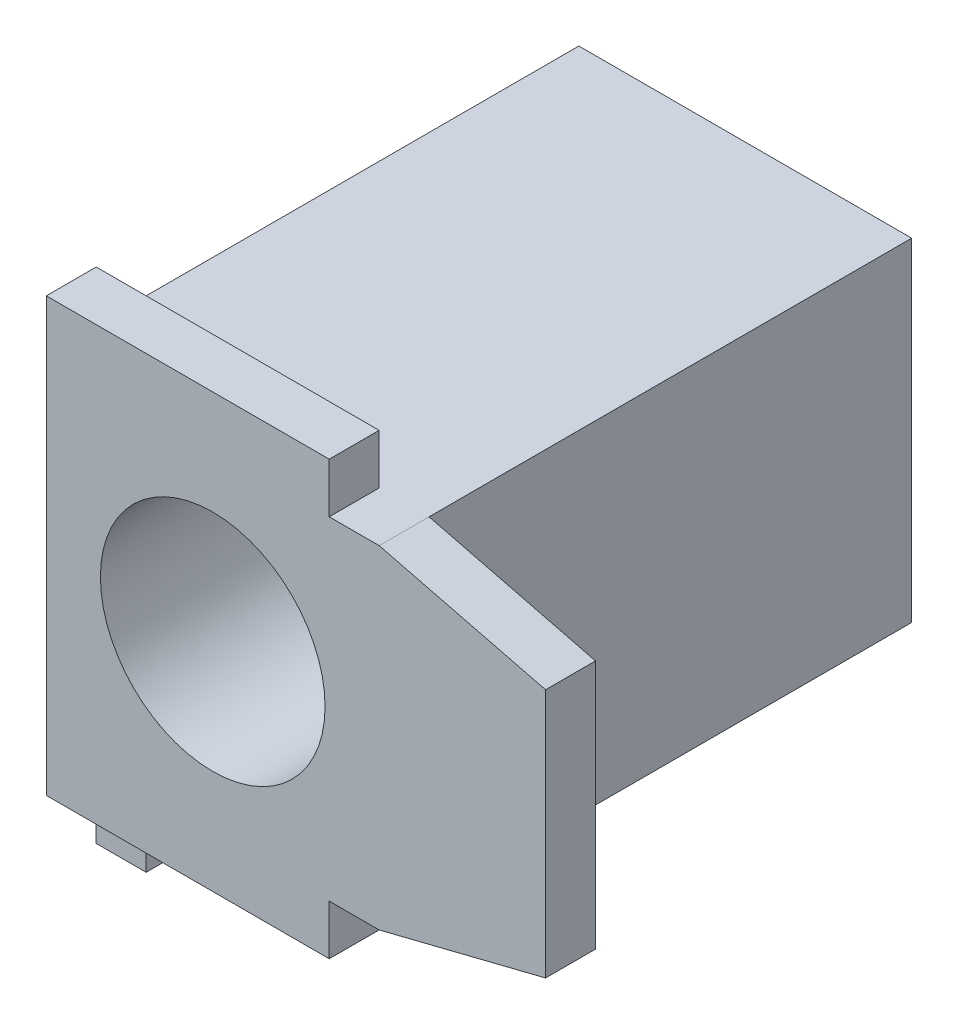
ISO-10303-21;
HEADER;
FILE_DESCRIPTION(('STEP AP214'),'2;1');
FILE_NAME('part.step','',(''),(''),'','','');
FILE_SCHEMA(('AUTOMOTIVE_DESIGN { 1 0 10303 214 1 1 1 1 }'));
ENDSEC;
DATA;
#1=APPLICATION_CONTEXT('core data for automotive mechanical design processes');
#2=APPLICATION_PROTOCOL_DEFINITION('international standard','automotive_design',2000,#1);
#3=PRODUCT_CONTEXT('',#1,'mechanical');
#4=PRODUCT('Part','Part','',(#3));
#5=PRODUCT_RELATED_PRODUCT_CATEGORY('part','',(#4));
#6=PRODUCT_DEFINITION_FORMATION('','',#4);
#7=PRODUCT_DEFINITION_CONTEXT('part definition',#1,'design');
#8=PRODUCT_DEFINITION('design','',#6,#7);
#9=PRODUCT_DEFINITION_SHAPE('','',#8);
#10=(LENGTH_UNIT() NAMED_UNIT(*) SI_UNIT(.MILLI.,.METRE.));
#11=(NAMED_UNIT(*) PLANE_ANGLE_UNIT() SI_UNIT($,.RADIAN.));
#12=(NAMED_UNIT(*) SI_UNIT($,.STERADIAN.) SOLID_ANGLE_UNIT());
#13=UNCERTAINTY_MEASURE_WITH_UNIT(LENGTH_MEASURE(1.E-05),#10,'distance_accuracy_value','');
#14=(GEOMETRIC_REPRESENTATION_CONTEXT(3) GLOBAL_UNCERTAINTY_ASSIGNED_CONTEXT((#13)) GLOBAL_UNIT_ASSIGNED_CONTEXT((#10,
#11,#12)) REPRESENTATION_CONTEXT('',''));
#15=CARTESIAN_POINT('',(0.,0.,0.));
#16=DIRECTION('',(0.,0.,1.));
#17=DIRECTION('',(1.,0.,0.));
#18=AXIS2_PLACEMENT_3D('',#15,#16,#17);
#19=CARTESIAN_POINT('',(-10.,-10.,27.));
#20=DIRECTION('',(0.,1.,0.));
#21=DIRECTION('',(0.,0.,1.));
#22=AXIS2_PLACEMENT_3D('',#19,#20,#21);
#23=PLANE('',#22);
#24=DIRECTION('',(0.,0.,-1.));
#25=VECTOR('',#24,1.);
#26=CARTESIAN_POINT('',(-7.,-10.,-4.99999999999999));
#27=LINE('',#26,#25);
#28=CARTESIAN_POINT('',(-7.,-10.,24.));
#29=VERTEX_POINT('',#28);
#30=CARTESIAN_POINT('',(-7.,-10.,-4.99999999999999));
#31=VERTEX_POINT('',#30);
#32=EDGE_CURVE('E57',#29,#31,#27,.T.);
#33=ORIENTED_EDGE('',*,*,#32,.T.);
#34=DIRECTION('',(-1.,0.,0.));
#35=VECTOR('',#34,1.);
#36=CARTESIAN_POINT('',(10.,-10.,-4.99999999999999));
#37=LINE('',#36,#35);
#38=CARTESIAN_POINT('',(10.,-10.,-4.99999999999999));
#39=VERTEX_POINT('',#38);
#40=EDGE_CURVE('E180',#39,#31,#37,.T.);
#41=ORIENTED_EDGE('',*,*,#40,.F.);
#42=DIRECTION('',(0.,0.,-1.));
#43=VECTOR('',#42,1.);
#44=CARTESIAN_POINT('',(10.,-10.,27.));
#45=LINE('',#44,#43);
#46=CARTESIAN_POINT('',(10.,-10.,24.));
#47=VERTEX_POINT('',#46);
#48=EDGE_CURVE('E332',#47,#39,#45,.T.);
#49=ORIENTED_EDGE('',*,*,#48,.F.);
#50=DIRECTION('',(0.,0.,-1.));
#51=VECTOR('',#50,1.);
#52=CARTESIAN_POINT('',(10.,-10.,34.));
#53=LINE('',#52,#51);
#54=CARTESIAN_POINT('',(10.,-10.,27.));
#55=VERTEX_POINT('',#54);
#56=EDGE_CURVE('E266',#55,#47,#53,.T.);
#57=ORIENTED_EDGE('',*,*,#56,.F.);
#58=DIRECTION('',(1.,0.,0.));
#59=VECTOR('',#58,1.);
#60=CARTESIAN_POINT('',(-10.,-10.,27.));
#61=LINE('',#60,#59);
#62=CARTESIAN_POINT('',(7.,-10.,27.));
#63=VERTEX_POINT('',#62);
#64=EDGE_CURVE('E329',#63,#55,#61,.T.);
#65=ORIENTED_EDGE('',*,*,#64,.F.);
#66=DIRECTION('',(0.,0.,-1.));
#67=VECTOR('',#66,1.);
#68=CARTESIAN_POINT('',(7.,-10.,24.));
#69=LINE('',#68,#67);
#70=CARTESIAN_POINT('',(7.,-10.,24.));
#71=VERTEX_POINT('',#70);
#72=EDGE_CURVE('E198',#63,#71,#69,.T.);
#73=ORIENTED_EDGE('',*,*,#72,.T.);
#74=DIRECTION('',(-1.,0.,0.));
#75=VECTOR('',#74,1.);
#76=CARTESIAN_POINT('',(7.,-10.,24.));
#77=LINE('',#76,#75);
#78=EDGE_CURVE('E205',#71,#29,#77,.T.);
#79=ORIENTED_EDGE('',*,*,#78,.T.);
#80=EDGE_LOOP('',(#33,#41,#49,#57,#65,#73,#79));
#81=FACE_BOUND('',#80,.T.);
#82=ADVANCED_FACE('F39',(#81),#23,.F.);
#83=CARTESIAN_POINT('',(7.,-13.,24.));
#84=DIRECTION('',(0.,0.,-1.));
#85=DIRECTION('',(-1.,0.,0.));
#86=AXIS2_PLACEMENT_3D('',#83,#84,#85);
#87=PLANE('',#86);
#88=DIRECTION('',(-1.,0.,0.));
#89=VECTOR('',#88,1.);
#90=CARTESIAN_POINT('',(7.,-13.,24.));
#91=LINE('',#90,#89);
#92=CARTESIAN_POINT('',(7.,-13.,24.));
#93=VERTEX_POINT('',#92);
#94=CARTESIAN_POINT('',(-7.,-13.,24.));
#95=VERTEX_POINT('',#94);
#96=EDGE_CURVE('E214',#93,#95,#91,.T.);
#97=ORIENTED_EDGE('',*,*,#96,.T.);
#98=DIRECTION('',(0.,1.,0.));
#99=VECTOR('',#98,1.);
#100=CARTESIAN_POINT('',(-7.,-10.,24.));
#101=LINE('',#100,#99);
#102=EDGE_CURVE('E65',#95,#29,#101,.T.);
#103=ORIENTED_EDGE('',*,*,#102,.T.);
#104=ORIENTED_EDGE('',*,*,#78,.F.);
#105=DIRECTION('',(0.,1.,0.));
#106=VECTOR('',#105,1.);
#107=CARTESIAN_POINT('',(7.,-13.,24.));
#108=LINE('',#107,#106);
#109=EDGE_CURVE('E217',#93,#71,#108,.T.);
#110=ORIENTED_EDGE('',*,*,#109,.F.);
#111=EDGE_LOOP('',(#97,#103,#104,#110));
#112=FACE_BOUND('',#111,.T.);
#113=ADVANCED_FACE('F427',(#112),#87,.T.);
#114=CARTESIAN_POINT('',(-10.,10.,27.));
#115=DIRECTION('',(0.,-1.,0.));
#116=DIRECTION('',(0.,0.,-1.));
#117=AXIS2_PLACEMENT_3D('',#114,#115,#116);
#118=PLANE('',#117);
#119=DIRECTION('',(0.,0.,-1.));
#120=VECTOR('',#119,1.);
#121=CARTESIAN_POINT('',(7.,10.,24.));
#122=LINE('',#121,#120);
#123=CARTESIAN_POINT('',(7.,10.,27.));
#124=VERTEX_POINT('',#123);
#125=CARTESIAN_POINT('',(7.,10.,24.));
#126=VERTEX_POINT('',#125);
#127=EDGE_CURVE('E228',#124,#126,#122,.T.);
#128=ORIENTED_EDGE('',*,*,#127,.F.);
#129=DIRECTION('',(-1.,0.,0.));
#130=VECTOR('',#129,1.);
#131=CARTESIAN_POINT('',(-10.,10.,27.));
#132=LINE('',#131,#130);
#133=CARTESIAN_POINT('',(10.,10.,27.));
#134=VERTEX_POINT('',#133);
#135=EDGE_CURVE('E319',#134,#124,#132,.T.);
#136=ORIENTED_EDGE('',*,*,#135,.F.);
#137=DIRECTION('',(0.,0.,-1.));
#138=VECTOR('',#137,1.);
#139=CARTESIAN_POINT('',(10.,10.,34.));
#140=LINE('',#139,#138);
#141=CARTESIAN_POINT('',(10.,10.,24.));
#142=VERTEX_POINT('',#141);
#143=EDGE_CURVE('E276',#134,#142,#140,.T.);
#144=ORIENTED_EDGE('',*,*,#143,.T.);
#145=DIRECTION('',(0.,0.,-1.));
#146=VECTOR('',#145,1.);
#147=CARTESIAN_POINT('',(10.,10.,27.));
#148=LINE('',#147,#146);
#149=CARTESIAN_POINT('',(10.,10.,-4.99999999999999));
#150=VERTEX_POINT('',#149);
#151=EDGE_CURVE('E338',#142,#150,#148,.T.);
#152=ORIENTED_EDGE('',*,*,#151,.T.);
#153=DIRECTION('',(1.,0.,0.));
#154=VECTOR('',#153,1.);
#155=CARTESIAN_POINT('',(10.,10.,-4.99999999999999));
#156=LINE('',#155,#154);
#157=CARTESIAN_POINT('',(-10.,10.,-4.99999999999999));
#158=VERTEX_POINT('',#157);
#159=EDGE_CURVE('E305',#158,#150,#156,.T.);
#160=ORIENTED_EDGE('',*,*,#159,.F.);
#161=DIRECTION('',(0.,0.,-1.));
#162=VECTOR('',#161,1.);
#163=CARTESIAN_POINT('',(-10.,10.,27.));
#164=LINE('',#163,#162);
#165=CARTESIAN_POINT('',(-10.,10.,24.));
#166=VERTEX_POINT('',#165);
#167=EDGE_CURVE('E335',#166,#158,#164,.T.);
#168=ORIENTED_EDGE('',*,*,#167,.F.);
#169=DIRECTION('',(-1.,0.,0.));
#170=VECTOR('',#169,1.);
#171=CARTESIAN_POINT('',(7.,10.,24.));
#172=LINE('',#171,#170);
#173=EDGE_CURVE('E234',#126,#166,#172,.T.);
#174=ORIENTED_EDGE('',*,*,#173,.F.);
#175=EDGE_LOOP('',(#128,#136,#144,#152,#160,#168,#174));
#176=FACE_BOUND('',#175,.T.);
#177=ADVANCED_FACE('F395',(#176),#118,.F.);
#178=CARTESIAN_POINT('',(0.,0.,27.));
#179=DIRECTION('',(0.,0.,1.));
#180=DIRECTION('',(1.,0.,0.));
#181=AXIS2_PLACEMENT_3D('',#178,#179,#180);
#182=PLANE('',#181);
#183=CARTESIAN_POINT('',(0.,0.,27.));
#184=DIRECTION('',(0.,0.,1.));
#185=DIRECTION('',(1.,0.,0.));
#186=AXIS2_PLACEMENT_3D('',#183,#184,#185);
#187=CIRCLE('',#186,6.75);
#188=CARTESIAN_POINT('',(6.75,0.,27.));
#189=VERTEX_POINT('',#188);
#190=EDGE_CURVE('E315',#189,#189,#187,.T.);
#191=ORIENTED_EDGE('',*,*,#190,.F.);
#192=EDGE_LOOP('',(#191));
#193=FACE_BOUND('',#192,.T.);
#194=DIRECTION('',(0.,-1.,0.));
#195=VECTOR('',#194,1.);
#196=CARTESIAN_POINT('',(-10.,10.,27.));
#197=LINE('',#196,#195);
#198=CARTESIAN_POINT('',(-10.,13.,27.));
#199=VERTEX_POINT('',#198);
#200=CARTESIAN_POINT('',(-10.,-13.,27.));
#201=VERTEX_POINT('',#200);
#202=EDGE_CURVE('E326',#199,#201,#197,.T.);
#203=ORIENTED_EDGE('',*,*,#202,.T.);
#204=DIRECTION('',(1.,0.,0.));
#205=VECTOR('',#204,1.);
#206=CARTESIAN_POINT('',(7.,-13.,27.));
#207=LINE('',#206,#205);
#208=CARTESIAN_POINT('',(7.,-13.,27.));
#209=VERTEX_POINT('',#208);
#210=EDGE_CURVE('E204',#201,#209,#207,.T.);
#211=ORIENTED_EDGE('',*,*,#210,.T.);
#212=DIRECTION('',(0.,1.,0.));
#213=VECTOR('',#212,1.);
#214=CARTESIAN_POINT('',(7.,-13.,27.));
#215=LINE('',#214,#213);
#216=EDGE_CURVE('E225',#209,#63,#215,.T.);
#217=ORIENTED_EDGE('',*,*,#216,.T.);
#218=ORIENTED_EDGE('',*,*,#64,.T.);
#219=DIRECTION('',(0.970142500145332,0.242535625036333,0.));
#220=VECTOR('',#219,1.);
#221=CARTESIAN_POINT('',(2.94117647058823,-11.7647058823529,27.));
#222=LINE('',#221,#220);
#223=CARTESIAN_POINT('',(20.,-7.5,27.));
#224=VERTEX_POINT('',#223);
#225=EDGE_CURVE('E269',#55,#224,#222,.T.);
#226=ORIENTED_EDGE('',*,*,#225,.T.);
#227=DIRECTION('',(0.,-1.,0.));
#228=VECTOR('',#227,1.);
#229=CARTESIAN_POINT('',(20.,10.,27.));
#230=LINE('',#229,#228);
#231=CARTESIAN_POINT('',(20.,7.5,27.));
#232=VERTEX_POINT('',#231);
#233=EDGE_CURVE('E284',#232,#224,#230,.T.);
#234=ORIENTED_EDGE('',*,*,#233,.F.);
#235=DIRECTION('',(0.970142500145332,-0.242535625036333,0.));
#236=VECTOR('',#235,1.);
#237=CARTESIAN_POINT('',(2.94117647058823,11.7647058823529,27.));
#238=LINE('',#237,#236);
#239=EDGE_CURVE('E280',#134,#232,#238,.T.);
#240=ORIENTED_EDGE('',*,*,#239,.F.);
#241=ORIENTED_EDGE('',*,*,#135,.T.);
#242=DIRECTION('',(0.,-1.,0.));
#243=VECTOR('',#242,1.);
#244=CARTESIAN_POINT('',(7.,13.,27.));
#245=LINE('',#244,#243);
#246=CARTESIAN_POINT('',(7.,13.,27.));
#247=VERTEX_POINT('',#246);
#248=EDGE_CURVE('E244',#247,#124,#245,.T.);
#249=ORIENTED_EDGE('',*,*,#248,.F.);
#250=DIRECTION('',(1.,0.,0.));
#251=VECTOR('',#250,1.);
#252=CARTESIAN_POINT('',(7.,13.,27.));
#253=LINE('',#252,#251);
#254=EDGE_CURVE('E241',#199,#247,#253,.T.);
#255=ORIENTED_EDGE('',*,*,#254,.F.);
#256=EDGE_LOOP('',(#203,#211,#217,#218,#226,#234,#240,#241,#249,#255));
#257=FACE_BOUND('',#256,.T.);
#258=ADVANCED_FACE('F393',(#193,#257),#182,.T.);
#259=CARTESIAN_POINT('',(20.,10.,24.));
#260=DIRECTION('',(0.,0.,1.));
#261=DIRECTION('',(0.,-1.,0.));
#262=AXIS2_PLACEMENT_3D('',#259,#260,#261);
#263=PLANE('',#262);
#264=DIRECTION('',(-0.970142500145332,-0.242535625036333,0.));
#265=VECTOR('',#264,1.);
#266=CARTESIAN_POINT('',(20.,-7.5,24.));
#267=LINE('',#266,#265);
#268=CARTESIAN_POINT('',(20.,-7.5,24.));
#269=VERTEX_POINT('',#268);
#270=EDGE_CURVE('E262',#269,#47,#267,.T.);
#271=ORIENTED_EDGE('',*,*,#270,.T.);
#272=DIRECTION('',(0.,1.,0.));
#273=VECTOR('',#272,1.);
#274=CARTESIAN_POINT('',(10.,10.,24.));
#275=LINE('',#274,#273);
#276=EDGE_CURVE('E283',#47,#142,#275,.T.);
#277=ORIENTED_EDGE('',*,*,#276,.T.);
#278=DIRECTION('',(-0.970142500145332,0.242535625036333,0.));
#279=VECTOR('',#278,1.);
#280=CARTESIAN_POINT('',(20.,7.5,24.));
#281=LINE('',#280,#279);
#282=CARTESIAN_POINT('',(20.,7.5,24.));
#283=VERTEX_POINT('',#282);
#284=EDGE_CURVE('E273',#283,#142,#281,.T.);
#285=ORIENTED_EDGE('',*,*,#284,.F.);
#286=DIRECTION('',(0.,1.,0.));
#287=VECTOR('',#286,1.);
#288=CARTESIAN_POINT('',(20.,10.,24.));
#289=LINE('',#288,#287);
#290=EDGE_CURVE('E288',#269,#283,#289,.T.);
#291=ORIENTED_EDGE('',*,*,#290,.F.);
#292=EDGE_LOOP('',(#271,#277,#285,#291));
#293=FACE_BOUND('',#292,.T.);
#294=ADVANCED_FACE('F382',(#293),#263,.F.);
#295=CARTESIAN_POINT('',(20.,0.,0.));
#296=DIRECTION('',(1.,0.,0.));
#297=DIRECTION('',(0.,0.,-1.));
#298=AXIS2_PLACEMENT_3D('',#295,#296,#297);
#299=PLANE('',#298);
#300=ORIENTED_EDGE('',*,*,#233,.T.);
#301=DIRECTION('',(0.,0.,-1.));
#302=VECTOR('',#301,1.);
#303=CARTESIAN_POINT('',(20.,-7.50000000000001,0.));
#304=LINE('',#303,#302);
#305=EDGE_CURVE('E11',#224,#269,#304,.T.);
#306=ORIENTED_EDGE('',*,*,#305,.T.);
#307=ORIENTED_EDGE('',*,*,#290,.T.);
#308=DIRECTION('',(0.,0.,-1.));
#309=VECTOR('',#308,1.);
#310=CARTESIAN_POINT('',(20.,7.50000000000001,0.));
#311=LINE('',#310,#309);
#312=EDGE_CURVE('E49',#232,#283,#311,.T.);
#313=ORIENTED_EDGE('',*,*,#312,.F.);
#314=EDGE_LOOP('',(#300,#306,#307,#313));
#315=FACE_BOUND('',#314,.T.);
#316=ADVANCED_FACE('F386',(#315),#299,.T.);
#317=CARTESIAN_POINT('',(10.,10.,27.));
#318=DIRECTION('',(-1.,0.,0.));
#319=DIRECTION('',(0.,0.,1.));
#320=AXIS2_PLACEMENT_3D('',#317,#318,#319);
#321=PLANE('',#320);
#322=ORIENTED_EDGE('',*,*,#276,.F.);
#323=ORIENTED_EDGE('',*,*,#48,.T.);
#324=DIRECTION('',(0.,-1.,0.));
#325=VECTOR('',#324,1.);
#326=CARTESIAN_POINT('',(10.,-10.,-4.99999999999999));
#327=LINE('',#326,#325);
#328=EDGE_CURVE('E309',#150,#39,#327,.T.);
#329=ORIENTED_EDGE('',*,*,#328,.F.);
#330=ORIENTED_EDGE('',*,*,#151,.F.);
#331=EDGE_LOOP('',(#322,#323,#329,#330));
#332=FACE_BOUND('',#331,.T.);
#333=ADVANCED_FACE('F41',(#332),#321,.F.);
#334=CARTESIAN_POINT('',(-10.,10.,27.));
#335=DIRECTION('',(1.,0.,0.));
#336=DIRECTION('',(0.,1.,0.));
#337=AXIS2_PLACEMENT_3D('',#334,#335,#336);
#338=PLANE('',#337);
#339=CARTESIAN_POINT('',(-10.,-13.,19.));
#340=DIRECTION('',(-1.,0.,0.));
#341=DIRECTION('',(0.,-1.,0.));
#342=AXIS2_PLACEMENT_3D('',#339,#340,#341);
#343=CIRCLE('',#342,2.);
#344=CARTESIAN_POINT('',(-10.,-15.,19.));
#345=VERTEX_POINT('',#344);
#346=EDGE_CURVE('E346',#345,#345,#343,.T.);
#347=ORIENTED_EDGE('',*,*,#346,.F.);
#348=EDGE_LOOP('',(#347));
#349=FACE_BOUND('',#348,.T.);
#350=CARTESIAN_POINT('',(-10.,-13.,-0.999999999999997));
#351=DIRECTION('',(-1.,0.,0.));
#352=DIRECTION('',(0.,-1.,0.));
#353=AXIS2_PLACEMENT_3D('',#350,#351,#352);
#354=CIRCLE('',#353,2.);
#355=CARTESIAN_POINT('',(-10.,-15.,-0.999999999999997));
#356=VERTEX_POINT('',#355);
#357=EDGE_CURVE('E188',#356,#356,#354,.T.);
#358=ORIENTED_EDGE('',*,*,#357,.F.);
#359=EDGE_LOOP('',(#358));
#360=FACE_BOUND('',#359,.T.);
#361=DIRECTION('',(0.,1.,0.));
#362=VECTOR('',#361,1.);
#363=CARTESIAN_POINT('',(-10.,-10.,-4.99999999999999));
#364=LINE('',#363,#362);
#365=CARTESIAN_POINT('',(-10.,-17.,-4.99999999999999));
#366=VERTEX_POINT('',#365);
#367=EDGE_CURVE('E299',#366,#158,#364,.T.);
#368=ORIENTED_EDGE('',*,*,#367,.F.);
#369=DIRECTION('',(0.,0.,1.));
#370=VECTOR('',#369,1.);
#371=CARTESIAN_POINT('',(-10.,-17.,-4.99999999999999));
#372=LINE('',#371,#370);
#373=CARTESIAN_POINT('',(-10.,-17.,24.));
#374=VERTEX_POINT('',#373);
#375=EDGE_CURVE('E161',#366,#374,#372,.T.);
#376=ORIENTED_EDGE('',*,*,#375,.T.);
#377=DIRECTION('',(0.,1.,0.));
#378=VECTOR('',#377,1.);
#379=CARTESIAN_POINT('',(-10.,-10.,24.));
#380=LINE('',#379,#378);
#381=CARTESIAN_POINT('',(-10.,-13.,24.));
#382=VERTEX_POINT('',#381);
#383=EDGE_CURVE('E182',#374,#382,#380,.T.);
#384=ORIENTED_EDGE('',*,*,#383,.T.);
#385=DIRECTION('',(0.,0.,1.));
#386=VECTOR('',#385,1.);
#387=CARTESIAN_POINT('',(-10.,-13.,24.));
#388=LINE('',#387,#386);
#389=EDGE_CURVE('E209',#382,#201,#388,.T.);
#390=ORIENTED_EDGE('',*,*,#389,.T.);
#391=ORIENTED_EDGE('',*,*,#202,.F.);
#392=DIRECTION('',(0.,0.,1.));
#393=VECTOR('',#392,1.);
#394=CARTESIAN_POINT('',(-10.,13.,24.));
#395=LINE('',#394,#393);
#396=CARTESIAN_POINT('',(-10.,13.,24.));
#397=VERTEX_POINT('',#396);
#398=EDGE_CURVE('E237',#397,#199,#395,.T.);
#399=ORIENTED_EDGE('',*,*,#398,.F.);
#400=DIRECTION('',(0.,-1.,0.));
#401=VECTOR('',#400,1.);
#402=CARTESIAN_POINT('',(-10.,13.,24.));
#403=LINE('',#402,#401);
#404=EDGE_CURVE('E254',#397,#166,#403,.T.);
#405=ORIENTED_EDGE('',*,*,#404,.T.);
#406=ORIENTED_EDGE('',*,*,#167,.T.);
#407=EDGE_LOOP('',(#368,#376,#384,#390,#391,#399,#405,#406));
#408=FACE_BOUND('',#407,.T.);
#409=ADVANCED_FACE('F362',(#349,#360,#408),#338,.F.);
#410=CARTESIAN_POINT('',(0.,0.,27.));
#411=DIRECTION('',(0.,0.,-1.));
#412=DIRECTION('',(-1.,0.,0.));
#413=AXIS2_PLACEMENT_3D('',#410,#411,#412);
#414=CYLINDRICAL_SURFACE('',#413,6.75);
#415=ORIENTED_EDGE('',*,*,#190,.T.);
#416=EDGE_LOOP('',(#415));
#417=FACE_BOUND('',#416,.T.);
#418=CARTESIAN_POINT('',(0.,0.,0.));
#419=DIRECTION('',(0.,0.,1.));
#420=DIRECTION('',(1.,0.,0.));
#421=AXIS2_PLACEMENT_3D('',#418,#419,#420);
#422=CIRCLE('',#421,6.75);
#423=CARTESIAN_POINT('',(6.75,0.,0.));
#424=VERTEX_POINT('',#423);
#425=EDGE_CURVE('E314',#424,#424,#422,.T.);
#426=ORIENTED_EDGE('',*,*,#425,.F.);
#427=EDGE_LOOP('',(#426));
#428=FACE_BOUND('',#427,.T.);
#429=ADVANCED_FACE('F365',(#417,#428),#414,.F.);
#430=CARTESIAN_POINT('',(0.,0.,0.));
#431=DIRECTION('',(0.,0.,1.));
#432=DIRECTION('',(1.,0.,0.));
#433=AXIS2_PLACEMENT_3D('',#430,#431,#432);
#434=PLANE('',#433);
#435=CARTESIAN_POINT('',(0.,0.,0.));
#436=DIRECTION('',(0.,0.,-1.));
#437=DIRECTION('',(-1.,0.,0.));
#438=AXIS2_PLACEMENT_3D('',#435,#436,#437);
#439=CIRCLE('',#438,1.5);
#440=CARTESIAN_POINT('',(-1.5,0.,0.));
#441=VERTEX_POINT('',#440);
#442=EDGE_CURVE('E291',#441,#441,#439,.T.);
#443=ORIENTED_EDGE('',*,*,#442,.T.);
#444=EDGE_LOOP('',(#443));
#445=FACE_BOUND('',#444,.T.);
#446=ORIENTED_EDGE('',*,*,#425,.T.);
#447=EDGE_LOOP('',(#446));
#448=FACE_BOUND('',#447,.T.);
#449=ADVANCED_FACE('F448',(#445,#448),#434,.T.);
#450=CARTESIAN_POINT('',(0.,0.,-4.99999999999999));
#451=DIRECTION('',(0.,0.,1.));
#452=DIRECTION('',(1.,0.,0.));
#453=AXIS2_PLACEMENT_3D('',#450,#451,#452);
#454=PLANE('',#453);
#455=ORIENTED_EDGE('',*,*,#367,.T.);
#456=ORIENTED_EDGE('',*,*,#159,.T.);
#457=ORIENTED_EDGE('',*,*,#328,.T.);
#458=ORIENTED_EDGE('',*,*,#40,.T.);
#459=DIRECTION('',(0.,-1.,0.));
#460=VECTOR('',#459,1.);
#461=CARTESIAN_POINT('',(-7.,-10.,-4.99999999999999));
#462=LINE('',#461,#460);
#463=CARTESIAN_POINT('',(-7.,-17.,-4.99999999999999));
#464=VERTEX_POINT('',#463);
#465=EDGE_CURVE('E172',#31,#464,#462,.T.);
#466=ORIENTED_EDGE('',*,*,#465,.T.);
#467=DIRECTION('',(-1.,0.,0.));
#468=VECTOR('',#467,1.);
#469=CARTESIAN_POINT('',(-7.,-17.,-4.99999999999999));
#470=LINE('',#469,#468);
#471=EDGE_CURVE('E156',#464,#366,#470,.T.);
#472=ORIENTED_EDGE('',*,*,#471,.T.);
#473=EDGE_LOOP('',(#455,#456,#457,#458,#466,#472));
#474=FACE_BOUND('',#473,.T.);
#475=CARTESIAN_POINT('',(0.,0.,-4.99999999999999));
#476=DIRECTION('',(0.,0.,-1.));
#477=DIRECTION('',(-1.,0.,0.));
#478=AXIS2_PLACEMENT_3D('',#475,#476,#477);
#479=CIRCLE('',#478,1.5);
#480=CARTESIAN_POINT('',(-1.5,0.,-4.99999999999999));
#481=VERTEX_POINT('',#480);
#482=EDGE_CURVE('E295',#481,#481,#479,.T.);
#483=ORIENTED_EDGE('',*,*,#482,.F.);
#484=EDGE_LOOP('',(#483));
#485=FACE_BOUND('',#484,.T.);
#486=ADVANCED_FACE('F177',(#474,#485),#454,.F.);
#487=CARTESIAN_POINT('',(0.,0.,-4.99999999999999));
#488=DIRECTION('',(0.,0.,1.));
#489=DIRECTION('',(1.,0.,0.));
#490=AXIS2_PLACEMENT_3D('',#487,#488,#489);
#491=CYLINDRICAL_SURFACE('',#490,1.5);
#492=ORIENTED_EDGE('',*,*,#482,.T.);
#493=EDGE_LOOP('',(#492));
#494=FACE_BOUND('',#493,.T.);
#495=ORIENTED_EDGE('',*,*,#442,.F.);
#496=EDGE_LOOP('',(#495));
#497=FACE_BOUND('',#496,.T.);
#498=ADVANCED_FACE('F457',(#494,#497),#491,.F.);
#499=CARTESIAN_POINT('',(20.,7.5,34.));
#500=DIRECTION('',(-0.242535625036333,-0.970142500145332,0.));
#501=DIRECTION('',(0.970142500145332,-0.242535625036333,0.));
#502=AXIS2_PLACEMENT_3D('',#499,#500,#501);
#503=PLANE('',#502);
#504=ORIENTED_EDGE('',*,*,#239,.T.);
#505=ORIENTED_EDGE('',*,*,#312,.T.);
#506=ORIENTED_EDGE('',*,*,#284,.T.);
#507=ORIENTED_EDGE('',*,*,#143,.F.);
#508=EDGE_LOOP('',(#504,#505,#506,#507));
#509=FACE_BOUND('',#508,.T.);
#510=ADVANCED_FACE('F389',(#509),#503,.F.);
#511=CARTESIAN_POINT('',(20.,-7.5,34.));
#512=DIRECTION('',(0.242535625036333,-0.970142500145332,0.));
#513=DIRECTION('',(0.970142500145332,0.242535625036333,0.));
#514=AXIS2_PLACEMENT_3D('',#511,#512,#513);
#515=PLANE('',#514);
#516=ORIENTED_EDGE('',*,*,#56,.T.);
#517=ORIENTED_EDGE('',*,*,#270,.F.);
#518=ORIENTED_EDGE('',*,*,#305,.F.);
#519=ORIENTED_EDGE('',*,*,#225,.F.);
#520=EDGE_LOOP('',(#516,#517,#518,#519));
#521=FACE_BOUND('',#520,.T.);
#522=ADVANCED_FACE('F379',(#521),#515,.T.);
#523=CARTESIAN_POINT('',(7.,13.,24.));
#524=DIRECTION('',(-1.,0.,0.));
#525=DIRECTION('',(0.,0.,1.));
#526=AXIS2_PLACEMENT_3D('',#523,#524,#525);
#527=PLANE('',#526);
#528=ORIENTED_EDGE('',*,*,#127,.T.);
#529=DIRECTION('',(0.,-1.,0.));
#530=VECTOR('',#529,1.);
#531=CARTESIAN_POINT('',(7.,13.,24.));
#532=LINE('',#531,#530);
#533=CARTESIAN_POINT('',(7.,13.,24.));
#534=VERTEX_POINT('',#533);
#535=EDGE_CURVE('E258',#534,#126,#532,.T.);
#536=ORIENTED_EDGE('',*,*,#535,.F.);
#537=DIRECTION('',(0.,0.,-1.));
#538=VECTOR('',#537,1.);
#539=CARTESIAN_POINT('',(7.,13.,24.));
#540=LINE('',#539,#538);
#541=EDGE_CURVE('E229',#247,#534,#540,.T.);
#542=ORIENTED_EDGE('',*,*,#541,.F.);
#543=ORIENTED_EDGE('',*,*,#248,.T.);
#544=EDGE_LOOP('',(#528,#536,#542,#543));
#545=FACE_BOUND('',#544,.T.);
#546=ADVANCED_FACE('F398',(#545),#527,.F.);
#547=CARTESIAN_POINT('',(7.,13.,24.));
#548=DIRECTION('',(0.,0.,1.));
#549=DIRECTION('',(1.,0.,0.));
#550=AXIS2_PLACEMENT_3D('',#547,#548,#549);
#551=PLANE('',#550);
#552=ORIENTED_EDGE('',*,*,#173,.T.);
#553=ORIENTED_EDGE('',*,*,#404,.F.);
#554=DIRECTION('',(-1.,0.,0.));
#555=VECTOR('',#554,1.);
#556=CARTESIAN_POINT('',(7.,13.,24.));
#557=LINE('',#556,#555);
#558=EDGE_CURVE('E233',#534,#397,#557,.T.);
#559=ORIENTED_EDGE('',*,*,#558,.F.);
#560=ORIENTED_EDGE('',*,*,#535,.T.);
#561=EDGE_LOOP('',(#552,#553,#559,#560));
#562=FACE_BOUND('',#561,.T.);
#563=ADVANCED_FACE('F471',(#562),#551,.F.);
#564=CARTESIAN_POINT('',(0.,13.,0.));
#565=DIRECTION('',(0.,-1.,0.));
#566=DIRECTION('',(0.,0.,-1.));
#567=AXIS2_PLACEMENT_3D('',#564,#565,#566);
#568=PLANE('',#567);
#569=ORIENTED_EDGE('',*,*,#541,.T.);
#570=ORIENTED_EDGE('',*,*,#558,.T.);
#571=ORIENTED_EDGE('',*,*,#398,.T.);
#572=ORIENTED_EDGE('',*,*,#254,.T.);
#573=EDGE_LOOP('',(#569,#570,#571,#572));
#574=FACE_BOUND('',#573,.T.);
#575=ADVANCED_FACE('F403',(#574),#568,.F.);
#576=CARTESIAN_POINT('',(7.,-13.,24.));
#577=DIRECTION('',(1.,0.,0.));
#578=DIRECTION('',(0.,0.,-1.));
#579=AXIS2_PLACEMENT_3D('',#576,#577,#578);
#580=PLANE('',#579);
#581=ORIENTED_EDGE('',*,*,#72,.F.);
#582=ORIENTED_EDGE('',*,*,#216,.F.);
#583=DIRECTION('',(0.,0.,-1.));
#584=VECTOR('',#583,1.);
#585=CARTESIAN_POINT('',(7.,-13.,24.));
#586=LINE('',#585,#584);
#587=EDGE_CURVE('E200',#209,#93,#586,.T.);
#588=ORIENTED_EDGE('',*,*,#587,.T.);
#589=ORIENTED_EDGE('',*,*,#109,.T.);
#590=EDGE_LOOP('',(#581,#582,#588,#589));
#591=FACE_BOUND('',#590,.T.);
#592=ADVANCED_FACE('F423',(#591),#580,.T.);
#593=CARTESIAN_POINT('',(0.,-13.,0.));
#594=DIRECTION('',(0.,1.,0.));
#595=DIRECTION('',(0.,0.,-1.));
#596=AXIS2_PLACEMENT_3D('',#593,#594,#595);
#597=PLANE('',#596);
#598=ORIENTED_EDGE('',*,*,#587,.F.);
#599=ORIENTED_EDGE('',*,*,#210,.F.);
#600=ORIENTED_EDGE('',*,*,#389,.F.);
#601=EDGE_CURVE('E213',#95,#382,#91,.T.);
#602=ORIENTED_EDGE('',*,*,#601,.F.);
#603=ORIENTED_EDGE('',*,*,#96,.F.);
#604=EDGE_LOOP('',(#598,#599,#600,#602,#603));
#605=FACE_BOUND('',#604,.T.);
#606=ADVANCED_FACE('F410',(#605),#597,.F.);
#607=CARTESIAN_POINT('',(-7.,-10.,24.));
#608=DIRECTION('',(0.,0.,1.));
#609=DIRECTION('',(1.,0.,0.));
#610=AXIS2_PLACEMENT_3D('',#607,#608,#609);
#611=PLANE('',#610);
#612=ORIENTED_EDGE('',*,*,#601,.T.);
#613=ORIENTED_EDGE('',*,*,#383,.F.);
#614=DIRECTION('',(-1.,0.,0.));
#615=VECTOR('',#614,1.);
#616=CARTESIAN_POINT('',(-7.,-17.,24.));
#617=LINE('',#616,#615);
#618=CARTESIAN_POINT('',(-7.,-17.,24.));
#619=VERTEX_POINT('',#618);
#620=EDGE_CURVE('E166',#619,#374,#617,.T.);
#621=ORIENTED_EDGE('',*,*,#620,.F.);
#622=EDGE_CURVE('E174',#619,#95,#101,.T.);
#623=ORIENTED_EDGE('',*,*,#622,.T.);
#624=EDGE_LOOP('',(#612,#613,#621,#623));
#625=FACE_BOUND('',#624,.T.);
#626=ADVANCED_FACE('F413',(#625),#611,.T.);
#627=CARTESIAN_POINT('',(-7.,-17.,-4.99999999999999));
#628=DIRECTION('',(0.,-1.,0.));
#629=DIRECTION('',(1.,0.,0.));
#630=AXIS2_PLACEMENT_3D('',#627,#628,#629);
#631=PLANE('',#630);
#632=ORIENTED_EDGE('',*,*,#375,.F.);
#633=ORIENTED_EDGE('',*,*,#471,.F.);
#634=DIRECTION('',(0.,0.,1.));
#635=VECTOR('',#634,1.);
#636=CARTESIAN_POINT('',(-7.,-17.,-4.99999999999999));
#637=LINE('',#636,#635);
#638=EDGE_CURVE('E159',#464,#619,#637,.T.);
#639=ORIENTED_EDGE('',*,*,#638,.T.);
#640=ORIENTED_EDGE('',*,*,#620,.T.);
#641=EDGE_LOOP('',(#632,#633,#639,#640));
#642=FACE_BOUND('',#641,.T.);
#643=ADVANCED_FACE('F158',(#642),#631,.T.);
#644=CARTESIAN_POINT('',(-7.,0.,0.));
#645=DIRECTION('',(-1.,0.,0.));
#646=DIRECTION('',(0.,0.,1.));
#647=AXIS2_PLACEMENT_3D('',#644,#645,#646);
#648=PLANE('',#647);
#649=CARTESIAN_POINT('',(-7.,-13.,19.));
#650=DIRECTION('',(-1.,0.,0.));
#651=DIRECTION('',(0.,0.,1.));
#652=AXIS2_PLACEMENT_3D('',#649,#650,#651);
#653=CIRCLE('',#652,2.);
#654=CARTESIAN_POINT('',(-7.,-13.,21.));
#655=VERTEX_POINT('',#654);
#656=EDGE_CURVE('E43',#655,#655,#653,.T.);
#657=ORIENTED_EDGE('',*,*,#656,.T.);
#658=EDGE_LOOP('',(#657));
#659=FACE_BOUND('',#658,.T.);
#660=CARTESIAN_POINT('',(-7.,-13.,-0.999999999999997));
#661=DIRECTION('',(-1.,0.,0.));
#662=DIRECTION('',(0.,0.,1.));
#663=AXIS2_PLACEMENT_3D('',#660,#661,#662);
#664=CIRCLE('',#663,2.);
#665=CARTESIAN_POINT('',(-7.,-13.,1.));
#666=VERTEX_POINT('',#665);
#667=EDGE_CURVE('E343',#666,#666,#664,.T.);
#668=ORIENTED_EDGE('',*,*,#667,.T.);
#669=EDGE_LOOP('',(#668));
#670=FACE_BOUND('',#669,.T.);
#671=ORIENTED_EDGE('',*,*,#465,.F.);
#672=ORIENTED_EDGE('',*,*,#32,.F.);
#673=ORIENTED_EDGE('',*,*,#102,.F.);
#674=ORIENTED_EDGE('',*,*,#622,.F.);
#675=ORIENTED_EDGE('',*,*,#638,.F.);
#676=EDGE_LOOP('',(#671,#672,#673,#674,#675));
#677=FACE_BOUND('',#676,.T.);
#678=ADVANCED_FACE('F171',(#659,#670,#677),#648,.F.);
#679=CARTESIAN_POINT('',(0.,-13.,-0.999999999999997));
#680=DIRECTION('',(-1.,0.,0.));
#681=DIRECTION('',(0.,-1.,0.));
#682=AXIS2_PLACEMENT_3D('',#679,#680,#681);
#683=CYLINDRICAL_SURFACE('',#682,2.);
#684=ORIENTED_EDGE('',*,*,#357,.T.);
#685=EDGE_LOOP('',(#684));
#686=FACE_BOUND('',#685,.T.);
#687=ORIENTED_EDGE('',*,*,#667,.F.);
#688=EDGE_LOOP('',(#687));
#689=FACE_BOUND('',#688,.T.);
#690=ADVANCED_FACE('F359',(#686,#689),#683,.F.);
#691=CARTESIAN_POINT('',(0.,-13.,19.));
#692=DIRECTION('',(-1.,0.,0.));
#693=DIRECTION('',(0.,-1.,0.));
#694=AXIS2_PLACEMENT_3D('',#691,#692,#693);
#695=CYLINDRICAL_SURFACE('',#694,2.);
#696=ORIENTED_EDGE('',*,*,#346,.T.);
#697=EDGE_LOOP('',(#696));
#698=FACE_BOUND('',#697,.T.);
#699=ORIENTED_EDGE('',*,*,#656,.F.);
#700=EDGE_LOOP('',(#699));
#701=FACE_BOUND('',#700,.T.);
#702=ADVANCED_FACE('F529',(#698,#701),#695,.F.);
#703=CLOSED_SHELL('',(#82,#113,#177,#258,#294,#316,#333,#409,#429,#449,#486,#498,#510,#522,#546,
#563,#575,#592,#606,#626,#643,#678,#690,#702));
#704=MANIFOLD_SOLID_BREP('B2',#703);
#705=ADVANCED_BREP_SHAPE_REPRESENTATION('',(#18,#704),#14);
#706=SHAPE_DEFINITION_REPRESENTATION(#9,#705);
ENDSEC;
END-ISO-10303-21;
